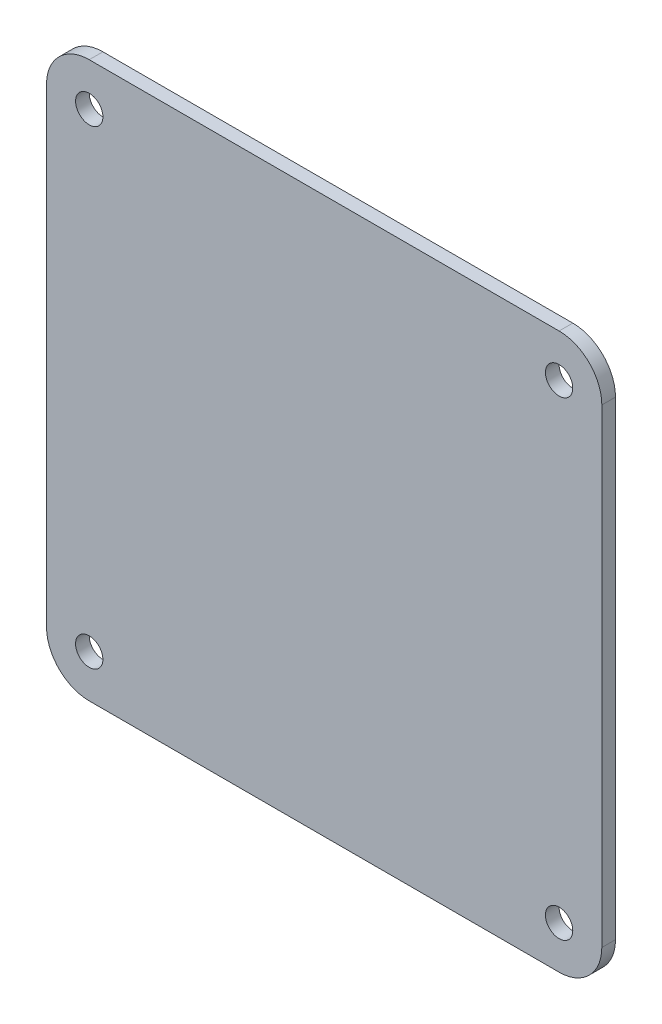
ISO-10303-21;
HEADER;
FILE_DESCRIPTION(('STEP AP214'),'2;1');
FILE_NAME('part.step','',(''),(''),'','','');
FILE_SCHEMA(('AUTOMOTIVE_DESIGN { 1 0 10303 214 1 1 1 1 }'));
ENDSEC;
DATA;
#1=APPLICATION_CONTEXT('core data for automotive mechanical design processes');
#2=APPLICATION_PROTOCOL_DEFINITION('international standard','automotive_design',2000,#1);
#3=PRODUCT_CONTEXT('',#1,'mechanical');
#4=PRODUCT('Part','Part','',(#3));
#5=PRODUCT_RELATED_PRODUCT_CATEGORY('part','',(#4));
#6=PRODUCT_DEFINITION_FORMATION('','',#4);
#7=PRODUCT_DEFINITION_CONTEXT('part definition',#1,'design');
#8=PRODUCT_DEFINITION('design','',#6,#7);
#9=PRODUCT_DEFINITION_SHAPE('','',#8);
#10=(LENGTH_UNIT() NAMED_UNIT(*) SI_UNIT(.MILLI.,.METRE.));
#11=(NAMED_UNIT(*) PLANE_ANGLE_UNIT() SI_UNIT($,.RADIAN.));
#12=(NAMED_UNIT(*) SI_UNIT($,.STERADIAN.) SOLID_ANGLE_UNIT());
#13=UNCERTAINTY_MEASURE_WITH_UNIT(LENGTH_MEASURE(1.E-05),#10,'distance_accuracy_value','');
#14=(GEOMETRIC_REPRESENTATION_CONTEXT(3) GLOBAL_UNCERTAINTY_ASSIGNED_CONTEXT((#13)) GLOBAL_UNIT_ASSIGNED_CONTEXT((#10,
#11,#12)) REPRESENTATION_CONTEXT('',''));
#15=CARTESIAN_POINT('',(0.,0.,0.));
#16=DIRECTION('',(0.,0.,1.));
#17=DIRECTION('',(1.,0.,0.));
#18=AXIS2_PLACEMENT_3D('',#15,#16,#17);
#19=CARTESIAN_POINT('',(0.,0.,1.6));
#20=DIRECTION('',(0.,0.,1.));
#21=DIRECTION('',(1.,0.,0.));
#22=AXIS2_PLACEMENT_3D('',#19,#20,#21);
#23=PLANE('',#22);
#24=CARTESIAN_POINT('',(-27.5,-27.5,1.6));
#25=DIRECTION('',(0.,0.,1.));
#26=DIRECTION('',(-1.,0.,0.));
#27=AXIS2_PLACEMENT_3D('',#24,#25,#26);
#28=CIRCLE('',#27,1.6);
#29=CARTESIAN_POINT('',(-29.1,-27.5,1.6));
#30=VERTEX_POINT('',#29);
#31=EDGE_CURVE('E199',#30,#30,#28,.T.);
#32=ORIENTED_EDGE('',*,*,#31,.F.);
#33=EDGE_LOOP('',(#32));
#34=FACE_BOUND('',#33,.T.);
#35=CARTESIAN_POINT('',(-27.5,27.5,1.6));
#36=DIRECTION('',(0.,0.,1.));
#37=DIRECTION('',(1.,0.,0.));
#38=AXIS2_PLACEMENT_3D('',#35,#36,#37);
#39=CIRCLE('',#38,1.6);
#40=CARTESIAN_POINT('',(-25.9,27.5,1.6));
#41=VERTEX_POINT('',#40);
#42=EDGE_CURVE('E137',#41,#41,#39,.T.);
#43=ORIENTED_EDGE('',*,*,#42,.F.);
#44=EDGE_LOOP('',(#43));
#45=FACE_BOUND('',#44,.T.);
#46=DIRECTION('',(0.,-1.,0.));
#47=VECTOR('',#46,1.);
#48=CARTESIAN_POINT('',(-32.5,-32.5,1.6));
#49=LINE('',#48,#47);
#50=CARTESIAN_POINT('',(-32.5,27.5,1.6));
#51=VERTEX_POINT('',#50);
#52=CARTESIAN_POINT('',(-32.5,-27.5,1.6));
#53=VERTEX_POINT('',#52);
#54=EDGE_CURVE('E142',#51,#53,#49,.T.);
#55=ORIENTED_EDGE('',*,*,#54,.T.);
#56=CARTESIAN_POINT('',(-27.5,-27.5,1.6));
#57=DIRECTION('',(0.,0.,1.));
#58=DIRECTION('',(1.,0.,0.));
#59=AXIS2_PLACEMENT_3D('',#56,#57,#58);
#60=CIRCLE('',#59,5.);
#61=CARTESIAN_POINT('',(-27.5,-32.5,1.6));
#62=VERTEX_POINT('',#61);
#63=EDGE_CURVE('E157',#53,#62,#60,.T.);
#64=ORIENTED_EDGE('',*,*,#63,.T.);
#65=DIRECTION('',(1.,0.,0.));
#66=VECTOR('',#65,1.);
#67=CARTESIAN_POINT('',(32.5,-32.5,1.6));
#68=LINE('',#67,#66);
#69=CARTESIAN_POINT('',(27.5,-32.5,1.6));
#70=VERTEX_POINT('',#69);
#71=EDGE_CURVE('E124',#62,#70,#68,.T.);
#72=ORIENTED_EDGE('',*,*,#71,.T.);
#73=CARTESIAN_POINT('',(27.5,-27.5,1.6));
#74=DIRECTION('',(0.,0.,1.));
#75=DIRECTION('',(1.,0.,0.));
#76=AXIS2_PLACEMENT_3D('',#73,#74,#75);
#77=CIRCLE('',#76,5.);
#78=CARTESIAN_POINT('',(32.5,-27.5,1.6));
#79=VERTEX_POINT('',#78);
#80=EDGE_CURVE('E155',#70,#79,#77,.T.);
#81=ORIENTED_EDGE('',*,*,#80,.T.);
#82=DIRECTION('',(0.,1.,0.));
#83=VECTOR('',#82,1.);
#84=CARTESIAN_POINT('',(32.5,-32.5,1.6));
#85=LINE('',#84,#83);
#86=CARTESIAN_POINT('',(32.5,27.5,1.6));
#87=VERTEX_POINT('',#86);
#88=EDGE_CURVE('E177',#79,#87,#85,.T.);
#89=ORIENTED_EDGE('',*,*,#88,.T.);
#90=CARTESIAN_POINT('',(27.5,27.5,1.6));
#91=DIRECTION('',(0.,0.,1.));
#92=DIRECTION('',(1.,0.,0.));
#93=AXIS2_PLACEMENT_3D('',#90,#91,#92);
#94=CIRCLE('',#93,5.);
#95=CARTESIAN_POINT('',(27.5,32.5,1.6));
#96=VERTEX_POINT('',#95);
#97=EDGE_CURVE('E59',#87,#96,#94,.T.);
#98=ORIENTED_EDGE('',*,*,#97,.T.);
#99=DIRECTION('',(-1.,0.,0.));
#100=VECTOR('',#99,1.);
#101=CARTESIAN_POINT('',(32.5,32.5,1.6));
#102=LINE('',#101,#100);
#103=CARTESIAN_POINT('',(-27.5,32.5,1.6));
#104=VERTEX_POINT('',#103);
#105=EDGE_CURVE('E143',#96,#104,#102,.T.);
#106=ORIENTED_EDGE('',*,*,#105,.T.);
#107=CARTESIAN_POINT('',(-27.5,27.5,1.6));
#108=DIRECTION('',(0.,0.,1.));
#109=DIRECTION('',(1.,0.,0.));
#110=AXIS2_PLACEMENT_3D('',#107,#108,#109);
#111=CIRCLE('',#110,5.);
#112=EDGE_CURVE('E153',#104,#51,#111,.T.);
#113=ORIENTED_EDGE('',*,*,#112,.T.);
#114=EDGE_LOOP('',(#55,#64,#72,#81,#89,#98,#106,#113));
#115=FACE_BOUND('',#114,.T.);
#116=CARTESIAN_POINT('',(27.5,27.5,1.6));
#117=DIRECTION('',(0.,0.,1.));
#118=DIRECTION('',(-1.,0.,0.));
#119=AXIS2_PLACEMENT_3D('',#116,#117,#118);
#120=CIRCLE('',#119,1.6);
#121=CARTESIAN_POINT('',(25.9,27.5,1.6));
#122=VERTEX_POINT('',#121);
#123=EDGE_CURVE('E190',#122,#122,#120,.T.);
#124=ORIENTED_EDGE('',*,*,#123,.F.);
#125=EDGE_LOOP('',(#124));
#126=FACE_BOUND('',#125,.T.);
#127=CARTESIAN_POINT('',(27.4999999999999,-27.5,1.6));
#128=DIRECTION('',(0.,0.,1.));
#129=DIRECTION('',(1.,0.,0.));
#130=AXIS2_PLACEMENT_3D('',#127,#128,#129);
#131=CIRCLE('',#130,1.6);
#132=CARTESIAN_POINT('',(29.0999999999999,-27.5,1.6));
#133=VERTEX_POINT('',#132);
#134=EDGE_CURVE('E193',#133,#133,#131,.T.);
#135=ORIENTED_EDGE('',*,*,#134,.F.);
#136=EDGE_LOOP('',(#135));
#137=FACE_BOUND('',#136,.T.);
#138=ADVANCED_FACE('F39',(#34,#45,#115,#126,#137),#23,.T.);
#139=CARTESIAN_POINT('',(0.,0.,0.));
#140=DIRECTION('',(0.,0.,1.));
#141=DIRECTION('',(1.,0.,0.));
#142=AXIS2_PLACEMENT_3D('',#139,#140,#141);
#143=PLANE('',#142);
#144=DIRECTION('',(1.,0.,0.));
#145=VECTOR('',#144,1.);
#146=CARTESIAN_POINT('',(32.5,-32.5,0.));
#147=LINE('',#146,#145);
#148=CARTESIAN_POINT('',(-27.5,-32.5,0.));
#149=VERTEX_POINT('',#148);
#150=CARTESIAN_POINT('',(27.5,-32.5,0.));
#151=VERTEX_POINT('',#150);
#152=EDGE_CURVE('E121',#149,#151,#147,.T.);
#153=ORIENTED_EDGE('',*,*,#152,.F.);
#154=CARTESIAN_POINT('',(-27.5,-27.5,0.));
#155=DIRECTION('',(0.,0.,1.));
#156=DIRECTION('',(1.,0.,0.));
#157=AXIS2_PLACEMENT_3D('',#154,#155,#156);
#158=CIRCLE('',#157,5.);
#159=CARTESIAN_POINT('',(-32.5,-27.5,0.));
#160=VERTEX_POINT('',#159);
#161=EDGE_CURVE('E104',#149,#160,#158,.F.);
#162=ORIENTED_EDGE('',*,*,#161,.T.);
#163=DIRECTION('',(0.,-1.,0.));
#164=VECTOR('',#163,1.);
#165=CARTESIAN_POINT('',(-32.5,-32.5,0.));
#166=LINE('',#165,#164);
#167=CARTESIAN_POINT('',(-32.5,27.5,0.));
#168=VERTEX_POINT('',#167);
#169=EDGE_CURVE('E132',#168,#160,#166,.T.);
#170=ORIENTED_EDGE('',*,*,#169,.F.);
#171=CARTESIAN_POINT('',(-27.5,27.5,0.));
#172=DIRECTION('',(0.,0.,1.));
#173=DIRECTION('',(1.,0.,0.));
#174=AXIS2_PLACEMENT_3D('',#171,#172,#173);
#175=CIRCLE('',#174,5.);
#176=CARTESIAN_POINT('',(-27.5,32.5,0.));
#177=VERTEX_POINT('',#176);
#178=EDGE_CURVE('E146',#168,#177,#175,.F.);
#179=ORIENTED_EDGE('',*,*,#178,.T.);
#180=DIRECTION('',(-1.,0.,0.));
#181=VECTOR('',#180,1.);
#182=CARTESIAN_POINT('',(32.5,32.5,0.));
#183=LINE('',#182,#181);
#184=CARTESIAN_POINT('',(27.5,32.5,0.));
#185=VERTEX_POINT('',#184);
#186=EDGE_CURVE('E135',#185,#177,#183,.T.);
#187=ORIENTED_EDGE('',*,*,#186,.F.);
#188=CARTESIAN_POINT('',(27.5,27.5,0.));
#189=DIRECTION('',(0.,0.,1.));
#190=DIRECTION('',(1.,0.,0.));
#191=AXIS2_PLACEMENT_3D('',#188,#189,#190);
#192=CIRCLE('',#191,5.);
#193=CARTESIAN_POINT('',(32.5,27.5,0.));
#194=VERTEX_POINT('',#193);
#195=EDGE_CURVE('E125',#185,#194,#192,.F.);
#196=ORIENTED_EDGE('',*,*,#195,.T.);
#197=DIRECTION('',(0.,1.,0.));
#198=VECTOR('',#197,1.);
#199=CARTESIAN_POINT('',(32.5,-32.5,0.));
#200=LINE('',#199,#198);
#201=CARTESIAN_POINT('',(32.5,-27.5,0.));
#202=VERTEX_POINT('',#201);
#203=EDGE_CURVE('E131',#202,#194,#200,.T.);
#204=ORIENTED_EDGE('',*,*,#203,.F.);
#205=CARTESIAN_POINT('',(27.5,-27.5,0.));
#206=DIRECTION('',(0.,0.,1.));
#207=DIRECTION('',(1.,0.,0.));
#208=AXIS2_PLACEMENT_3D('',#205,#206,#207);
#209=CIRCLE('',#208,5.);
#210=EDGE_CURVE('E115',#202,#151,#209,.F.);
#211=ORIENTED_EDGE('',*,*,#210,.T.);
#212=EDGE_LOOP('',(#153,#162,#170,#179,#187,#196,#204,#211));
#213=FACE_BOUND('',#212,.T.);
#214=CARTESIAN_POINT('',(-27.5,27.5,0.));
#215=DIRECTION('',(0.,0.,1.));
#216=DIRECTION('',(1.,0.,0.));
#217=AXIS2_PLACEMENT_3D('',#214,#215,#216);
#218=CIRCLE('',#217,1.6);
#219=CARTESIAN_POINT('',(-25.9,27.5,0.));
#220=VERTEX_POINT('',#219);
#221=EDGE_CURVE('E180',#220,#220,#218,.T.);
#222=ORIENTED_EDGE('',*,*,#221,.T.);
#223=EDGE_LOOP('',(#222));
#224=FACE_BOUND('',#223,.T.);
#225=CARTESIAN_POINT('',(27.5,27.5,0.));
#226=DIRECTION('',(0.,0.,1.));
#227=DIRECTION('',(-1.,0.,0.));
#228=AXIS2_PLACEMENT_3D('',#225,#226,#227);
#229=CIRCLE('',#228,1.6);
#230=CARTESIAN_POINT('',(25.9,27.5,0.));
#231=VERTEX_POINT('',#230);
#232=EDGE_CURVE('E205',#231,#231,#229,.T.);
#233=ORIENTED_EDGE('',*,*,#232,.T.);
#234=EDGE_LOOP('',(#233));
#235=FACE_BOUND('',#234,.T.);
#236=CARTESIAN_POINT('',(-27.5,-27.5,0.));
#237=DIRECTION('',(0.,0.,1.));
#238=DIRECTION('',(-1.,0.,0.));
#239=AXIS2_PLACEMENT_3D('',#236,#237,#238);
#240=CIRCLE('',#239,1.6);
#241=CARTESIAN_POINT('',(-29.1,-27.5,0.));
#242=VERTEX_POINT('',#241);
#243=EDGE_CURVE('E195',#242,#242,#240,.T.);
#244=ORIENTED_EDGE('',*,*,#243,.T.);
#245=EDGE_LOOP('',(#244));
#246=FACE_BOUND('',#245,.T.);
#247=CARTESIAN_POINT('',(27.4999999999999,-27.5,0.));
#248=DIRECTION('',(0.,0.,1.));
#249=DIRECTION('',(1.,0.,0.));
#250=AXIS2_PLACEMENT_3D('',#247,#248,#249);
#251=CIRCLE('',#250,1.6);
#252=CARTESIAN_POINT('',(29.0999999999999,-27.5,0.));
#253=VERTEX_POINT('',#252);
#254=EDGE_CURVE('E196',#253,#253,#251,.T.);
#255=ORIENTED_EDGE('',*,*,#254,.T.);
#256=EDGE_LOOP('',(#255));
#257=FACE_BOUND('',#256,.T.);
#258=ADVANCED_FACE('F128',(#213,#224,#235,#246,#257),#143,.F.);
#259=CARTESIAN_POINT('',(-32.5,-32.5,1.6));
#260=DIRECTION('',(1.,0.,0.));
#261=DIRECTION('',(0.,0.,-1.));
#262=AXIS2_PLACEMENT_3D('',#259,#260,#261);
#263=PLANE('',#262);
#264=ORIENTED_EDGE('',*,*,#169,.T.);
#265=DIRECTION('',(0.,0.,-1.));
#266=VECTOR('',#265,1.);
#267=CARTESIAN_POINT('',(-32.5,-27.5,1.6));
#268=LINE('',#267,#266);
#269=EDGE_CURVE('E109',#160,#53,#268,.F.);
#270=ORIENTED_EDGE('',*,*,#269,.T.);
#271=ORIENTED_EDGE('',*,*,#54,.F.);
#272=DIRECTION('',(0.,0.,-1.));
#273=VECTOR('',#272,1.);
#274=CARTESIAN_POINT('',(-32.5,27.5,1.6));
#275=LINE('',#274,#273);
#276=EDGE_CURVE('E114',#51,#168,#275,.T.);
#277=ORIENTED_EDGE('',*,*,#276,.T.);
#278=EDGE_LOOP('',(#264,#270,#271,#277));
#279=FACE_BOUND('',#278,.T.);
#280=ADVANCED_FACE('F174',(#279),#263,.F.);
#281=CARTESIAN_POINT('',(32.5,-32.5,1.6));
#282=DIRECTION('',(0.,1.,0.));
#283=DIRECTION('',(-1.,0.,0.));
#284=AXIS2_PLACEMENT_3D('',#281,#282,#283);
#285=PLANE('',#284);
#286=ORIENTED_EDGE('',*,*,#71,.F.);
#287=DIRECTION('',(0.,0.,-1.));
#288=VECTOR('',#287,1.);
#289=CARTESIAN_POINT('',(-27.5,-32.5,1.6));
#290=LINE('',#289,#288);
#291=EDGE_CURVE('E108',#62,#149,#290,.T.);
#292=ORIENTED_EDGE('',*,*,#291,.T.);
#293=ORIENTED_EDGE('',*,*,#152,.T.);
#294=DIRECTION('',(0.,0.,-1.));
#295=VECTOR('',#294,1.);
#296=CARTESIAN_POINT('',(27.5,-32.5,1.6));
#297=LINE('',#296,#295);
#298=EDGE_CURVE('E126',#151,#70,#297,.F.);
#299=ORIENTED_EDGE('',*,*,#298,.T.);
#300=EDGE_LOOP('',(#286,#292,#293,#299));
#301=FACE_BOUND('',#300,.T.);
#302=ADVANCED_FACE('F120',(#301),#285,.F.);
#303=CARTESIAN_POINT('',(32.5,-32.5,1.6));
#304=DIRECTION('',(-1.,0.,0.));
#305=DIRECTION('',(0.,0.,1.));
#306=AXIS2_PLACEMENT_3D('',#303,#304,#305);
#307=PLANE('',#306);
#308=ORIENTED_EDGE('',*,*,#88,.F.);
#309=DIRECTION('',(0.,0.,-1.));
#310=VECTOR('',#309,1.);
#311=CARTESIAN_POINT('',(32.5,-27.5,1.6));
#312=LINE('',#311,#310);
#313=EDGE_CURVE('E161',#79,#202,#312,.T.);
#314=ORIENTED_EDGE('',*,*,#313,.T.);
#315=ORIENTED_EDGE('',*,*,#203,.T.);
#316=DIRECTION('',(0.,0.,-1.));
#317=VECTOR('',#316,1.);
#318=CARTESIAN_POINT('',(32.5,27.5,1.6));
#319=LINE('',#318,#317);
#320=EDGE_CURVE('E159',#194,#87,#319,.F.);
#321=ORIENTED_EDGE('',*,*,#320,.T.);
#322=EDGE_LOOP('',(#308,#314,#315,#321));
#323=FACE_BOUND('',#322,.T.);
#324=ADVANCED_FACE('F227',(#323),#307,.F.);
#325=CARTESIAN_POINT('',(32.5,32.5,1.6));
#326=DIRECTION('',(0.,-1.,0.));
#327=DIRECTION('',(1.,0.,0.));
#328=AXIS2_PLACEMENT_3D('',#325,#326,#327);
#329=PLANE('',#328);
#330=ORIENTED_EDGE('',*,*,#186,.T.);
#331=DIRECTION('',(0.,0.,-1.));
#332=VECTOR('',#331,1.);
#333=CARTESIAN_POINT('',(-27.5,32.5,1.6));
#334=LINE('',#333,#332);
#335=EDGE_CURVE('E11',#177,#104,#334,.F.);
#336=ORIENTED_EDGE('',*,*,#335,.T.);
#337=ORIENTED_EDGE('',*,*,#105,.F.);
#338=DIRECTION('',(0.,0.,-1.));
#339=VECTOR('',#338,1.);
#340=CARTESIAN_POINT('',(27.5,32.5,1.6));
#341=LINE('',#340,#339);
#342=EDGE_CURVE('E47',#96,#185,#341,.T.);
#343=ORIENTED_EDGE('',*,*,#342,.T.);
#344=EDGE_LOOP('',(#330,#336,#337,#343));
#345=FACE_BOUND('',#344,.T.);
#346=ADVANCED_FACE('F166',(#345),#329,.F.);
#347=CARTESIAN_POINT('',(-27.5,27.5,1.6));
#348=DIRECTION('',(0.,0.,-1.));
#349=DIRECTION('',(-1.,0.,0.));
#350=AXIS2_PLACEMENT_3D('',#347,#348,#349);
#351=CYLINDRICAL_SURFACE('',#350,1.6);
#352=ORIENTED_EDGE('',*,*,#42,.T.);
#353=EDGE_LOOP('',(#352));
#354=FACE_BOUND('',#353,.T.);
#355=ORIENTED_EDGE('',*,*,#221,.F.);
#356=EDGE_LOOP('',(#355));
#357=FACE_BOUND('',#356,.T.);
#358=ADVANCED_FACE('F216',(#354,#357),#351,.F.);
#359=CARTESIAN_POINT('',(27.5,27.5,1.6));
#360=DIRECTION('',(0.,0.,-1.));
#361=DIRECTION('',(-1.,0.,0.));
#362=AXIS2_PLACEMENT_3D('',#359,#360,#361);
#363=CYLINDRICAL_SURFACE('',#362,1.6);
#364=ORIENTED_EDGE('',*,*,#123,.T.);
#365=EDGE_LOOP('',(#364));
#366=FACE_BOUND('',#365,.T.);
#367=ORIENTED_EDGE('',*,*,#232,.F.);
#368=EDGE_LOOP('',(#367));
#369=FACE_BOUND('',#368,.T.);
#370=ADVANCED_FACE('F218',(#366,#369),#363,.F.);
#371=CARTESIAN_POINT('',(-27.5,-27.5,1.6));
#372=DIRECTION('',(0.,0.,-1.));
#373=DIRECTION('',(-1.,0.,0.));
#374=AXIS2_PLACEMENT_3D('',#371,#372,#373);
#375=CYLINDRICAL_SURFACE('',#374,1.6);
#376=ORIENTED_EDGE('',*,*,#31,.T.);
#377=EDGE_LOOP('',(#376));
#378=FACE_BOUND('',#377,.T.);
#379=ORIENTED_EDGE('',*,*,#243,.F.);
#380=EDGE_LOOP('',(#379));
#381=FACE_BOUND('',#380,.T.);
#382=ADVANCED_FACE('F223',(#378,#381),#375,.F.);
#383=CARTESIAN_POINT('',(27.4999999999999,-27.5,1.6));
#384=DIRECTION('',(0.,0.,-1.));
#385=DIRECTION('',(-1.,0.,0.));
#386=AXIS2_PLACEMENT_3D('',#383,#384,#385);
#387=CYLINDRICAL_SURFACE('',#386,1.6);
#388=ORIENTED_EDGE('',*,*,#134,.T.);
#389=EDGE_LOOP('',(#388));
#390=FACE_BOUND('',#389,.T.);
#391=ORIENTED_EDGE('',*,*,#254,.F.);
#392=EDGE_LOOP('',(#391));
#393=FACE_BOUND('',#392,.T.);
#394=ADVANCED_FACE('F243',(#390,#393),#387,.F.);
#395=CARTESIAN_POINT('',(-27.5,-27.5,1.6));
#396=DIRECTION('',(0.,0.,-1.));
#397=DIRECTION('',(-1.,0.,0.));
#398=AXIS2_PLACEMENT_3D('',#395,#396,#397);
#399=CYLINDRICAL_SURFACE('',#398,5.);
#400=ORIENTED_EDGE('',*,*,#63,.F.);
#401=ORIENTED_EDGE('',*,*,#269,.F.);
#402=ORIENTED_EDGE('',*,*,#161,.F.);
#403=ORIENTED_EDGE('',*,*,#291,.F.);
#404=EDGE_LOOP('',(#400,#401,#402,#403));
#405=FACE_BOUND('',#404,.T.);
#406=ADVANCED_FACE('F107',(#405),#399,.T.);
#407=CARTESIAN_POINT('',(27.5,-27.5,1.6));
#408=DIRECTION('',(0.,0.,-1.));
#409=DIRECTION('',(-1.,0.,0.));
#410=AXIS2_PLACEMENT_3D('',#407,#408,#409);
#411=CYLINDRICAL_SURFACE('',#410,5.);
#412=ORIENTED_EDGE('',*,*,#80,.F.);
#413=ORIENTED_EDGE('',*,*,#298,.F.);
#414=ORIENTED_EDGE('',*,*,#210,.F.);
#415=ORIENTED_EDGE('',*,*,#313,.F.);
#416=EDGE_LOOP('',(#412,#413,#414,#415));
#417=FACE_BOUND('',#416,.T.);
#418=ADVANCED_FACE('F242',(#417),#411,.T.);
#419=CARTESIAN_POINT('',(-27.5,27.5,1.6));
#420=DIRECTION('',(0.,0.,-1.));
#421=DIRECTION('',(-1.,0.,0.));
#422=AXIS2_PLACEMENT_3D('',#419,#420,#421);
#423=CYLINDRICAL_SURFACE('',#422,5.);
#424=ORIENTED_EDGE('',*,*,#112,.F.);
#425=ORIENTED_EDGE('',*,*,#335,.F.);
#426=ORIENTED_EDGE('',*,*,#178,.F.);
#427=ORIENTED_EDGE('',*,*,#276,.F.);
#428=EDGE_LOOP('',(#424,#425,#426,#427));
#429=FACE_BOUND('',#428,.T.);
#430=ADVANCED_FACE('F171',(#429),#423,.T.);
#431=CARTESIAN_POINT('',(27.5,27.5,1.6));
#432=DIRECTION('',(0.,0.,-1.));
#433=DIRECTION('',(-1.,0.,0.));
#434=AXIS2_PLACEMENT_3D('',#431,#432,#433);
#435=CYLINDRICAL_SURFACE('',#434,5.);
#436=ORIENTED_EDGE('',*,*,#97,.F.);
#437=ORIENTED_EDGE('',*,*,#320,.F.);
#438=ORIENTED_EDGE('',*,*,#195,.F.);
#439=ORIENTED_EDGE('',*,*,#342,.F.);
#440=EDGE_LOOP('',(#436,#437,#438,#439));
#441=FACE_BOUND('',#440,.T.);
#442=ADVANCED_FACE('F41',(#441),#435,.T.);
#443=CLOSED_SHELL('',(#138,#258,#280,#302,#324,#346,#358,#370,#382,#394,#406,#418,#430,#442));
#444=MANIFOLD_SOLID_BREP('B2',#443);
#445=ADVANCED_BREP_SHAPE_REPRESENTATION('',(#18,#444),#14);
#446=SHAPE_DEFINITION_REPRESENTATION(#9,#445);
ENDSEC;
END-ISO-10303-21;
